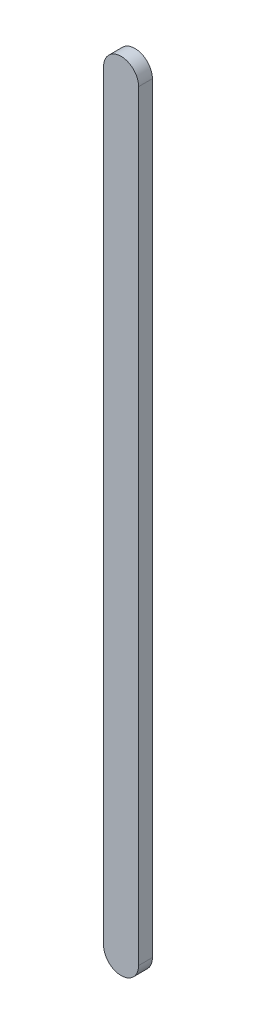
ISO-10303-21;
HEADER;
FILE_DESCRIPTION(('STEP AP214'),'2;1');
FILE_NAME('part.step','',(''),(''),'','','');
FILE_SCHEMA(('AUTOMOTIVE_DESIGN { 1 0 10303 214 1 1 1 1 }'));
ENDSEC;
DATA;
#1=APPLICATION_CONTEXT('core data for automotive mechanical design processes');
#2=APPLICATION_PROTOCOL_DEFINITION('international standard','automotive_design',2000,#1);
#3=PRODUCT_CONTEXT('',#1,'mechanical');
#4=PRODUCT('Part','Part','',(#3));
#5=PRODUCT_RELATED_PRODUCT_CATEGORY('part','',(#4));
#6=PRODUCT_DEFINITION_FORMATION('','',#4);
#7=PRODUCT_DEFINITION_CONTEXT('part definition',#1,'design');
#8=PRODUCT_DEFINITION('design','',#6,#7);
#9=PRODUCT_DEFINITION_SHAPE('','',#8);
#10=(LENGTH_UNIT() NAMED_UNIT(*) SI_UNIT(.MILLI.,.METRE.));
#11=(NAMED_UNIT(*) PLANE_ANGLE_UNIT() SI_UNIT($,.RADIAN.));
#12=(NAMED_UNIT(*) SI_UNIT($,.STERADIAN.) SOLID_ANGLE_UNIT());
#13=UNCERTAINTY_MEASURE_WITH_UNIT(LENGTH_MEASURE(1.E-05),#10,'distance_accuracy_value','');
#14=(GEOMETRIC_REPRESENTATION_CONTEXT(3) GLOBAL_UNCERTAINTY_ASSIGNED_CONTEXT((#13)) GLOBAL_UNIT_ASSIGNED_CONTEXT((#10,
#11,#12)) REPRESENTATION_CONTEXT('',''));
#15=CARTESIAN_POINT('',(0.,0.,0.));
#16=DIRECTION('',(0.,0.,1.));
#17=DIRECTION('',(1.,0.,0.));
#18=AXIS2_PLACEMENT_3D('',#15,#16,#17);
#19=CARTESIAN_POINT('',(95.885,105.4070028,0.));
#20=DIRECTION('',(-1.,0.,0.));
#21=DIRECTION('',(0.,1.,0.));
#22=AXIS2_PLACEMENT_3D('',#19,#20,#21);
#23=PLANE('',#22);
#24=DIRECTION('',(0.,1.,0.));
#25=VECTOR('',#24,1.);
#26=CARTESIAN_POINT('',(95.885,105.4070028,0.1999996));
#27=LINE('',#26,#25);
#28=CARTESIAN_POINT('',(95.885,105.4070028,0.1999996));
#29=VERTEX_POINT('',#28);
#30=CARTESIAN_POINT('',(95.885,116.459,0.1999996));
#31=VERTEX_POINT('',#30);
#32=EDGE_CURVE('E11',#29,#31,#27,.T.);
#33=ORIENTED_EDGE('',*,*,#32,.F.);
#34=DIRECTION('',(0.,0.,1.));
#35=VECTOR('',#34,1.);
#36=CARTESIAN_POINT('',(95.885,105.4070028,0.));
#37=LINE('',#36,#35);
#38=CARTESIAN_POINT('',(95.885,105.4070028,0.));
#39=VERTEX_POINT('',#38);
#40=EDGE_CURVE('E24',#39,#29,#37,.T.);
#41=ORIENTED_EDGE('',*,*,#40,.F.);
#42=DIRECTION('',(0.,1.,0.));
#43=VECTOR('',#42,1.);
#44=CARTESIAN_POINT('',(95.885,105.4070028,0.));
#45=LINE('',#44,#43);
#46=CARTESIAN_POINT('',(95.885,116.459,0.));
#47=VERTEX_POINT('',#46);
#48=EDGE_CURVE('E75',#39,#47,#45,.T.);
#49=ORIENTED_EDGE('',*,*,#48,.T.);
#50=DIRECTION('',(0.,0.,1.));
#51=VECTOR('',#50,1.);
#52=CARTESIAN_POINT('',(95.885,116.459,0.));
#53=LINE('',#52,#51);
#54=EDGE_CURVE('E37',#47,#31,#53,.T.);
#55=ORIENTED_EDGE('',*,*,#54,.T.);
#56=EDGE_LOOP('',(#33,#41,#49,#55));
#57=FACE_BOUND('',#56,.T.);
#58=ADVANCED_FACE('F17',(#57),#23,.F.);
#59=CARTESIAN_POINT('',(95.631,116.459,0.));
#60=DIRECTION('',(0.,0.,-1.));
#61=DIRECTION('',(1.,1.11896493820486E-13,0.));
#62=AXIS2_PLACEMENT_3D('',#59,#60,#61);
#63=CYLINDRICAL_SURFACE('',#62,0.25400000000001);
#64=CARTESIAN_POINT('',(95.631,116.459,0.1999996));
#65=DIRECTION('',(0.,0.,1.));
#66=DIRECTION('',(1.,1.11896493820486E-13,0.));
#67=AXIS2_PLACEMENT_3D('',#64,#65,#66);
#68=CIRCLE('',#67,0.25400000000001);
#69=CARTESIAN_POINT('',(95.377,116.459,0.1999996));
#70=VERTEX_POINT('',#69);
#71=EDGE_CURVE('E83',#31,#70,#68,.T.);
#72=ORIENTED_EDGE('',*,*,#71,.F.);
#73=ORIENTED_EDGE('',*,*,#54,.F.);
#74=CARTESIAN_POINT('',(95.631,116.459,0.));
#75=DIRECTION('',(0.,0.,1.));
#76=DIRECTION('',(1.,1.11896493820486E-13,0.));
#77=AXIS2_PLACEMENT_3D('',#74,#75,#76);
#78=CIRCLE('',#77,0.25400000000001);
#79=CARTESIAN_POINT('',(95.377,116.459,0.));
#80=VERTEX_POINT('',#79);
#81=EDGE_CURVE('E81',#47,#80,#78,.T.);
#82=ORIENTED_EDGE('',*,*,#81,.T.);
#83=DIRECTION('',(0.,0.,1.));
#84=VECTOR('',#83,1.);
#85=CARTESIAN_POINT('',(95.377,116.459,0.));
#86=LINE('',#85,#84);
#87=EDGE_CURVE('E67',#80,#70,#86,.T.);
#88=ORIENTED_EDGE('',*,*,#87,.T.);
#89=EDGE_LOOP('',(#72,#73,#82,#88));
#90=FACE_BOUND('',#89,.T.);
#91=ADVANCED_FACE('F89',(#90),#63,.T.);
#92=CARTESIAN_POINT('',(95.377,116.459,0.));
#93=DIRECTION('',(1.,0.,0.));
#94=DIRECTION('',(0.,-1.,0.));
#95=AXIS2_PLACEMENT_3D('',#92,#93,#94);
#96=PLANE('',#95);
#97=DIRECTION('',(0.,-1.,0.));
#98=VECTOR('',#97,1.);
#99=CARTESIAN_POINT('',(95.377,116.459,0.1999996));
#100=LINE('',#99,#98);
#101=CARTESIAN_POINT('',(95.377,105.4070028,0.1999996));
#102=VERTEX_POINT('',#101);
#103=EDGE_CURVE('E71',#70,#102,#100,.T.);
#104=ORIENTED_EDGE('',*,*,#103,.F.);
#105=ORIENTED_EDGE('',*,*,#87,.F.);
#106=DIRECTION('',(0.,-1.,0.));
#107=VECTOR('',#106,1.);
#108=CARTESIAN_POINT('',(95.377,116.459,0.));
#109=LINE('',#108,#107);
#110=CARTESIAN_POINT('',(95.377,105.4070028,0.));
#111=VERTEX_POINT('',#110);
#112=EDGE_CURVE('E63',#80,#111,#109,.T.);
#113=ORIENTED_EDGE('',*,*,#112,.T.);
#114=DIRECTION('',(0.,0.,1.));
#115=VECTOR('',#114,1.);
#116=CARTESIAN_POINT('',(95.377,105.4070028,0.));
#117=LINE('',#116,#115);
#118=EDGE_CURVE('E53',#111,#102,#117,.T.);
#119=ORIENTED_EDGE('',*,*,#118,.T.);
#120=EDGE_LOOP('',(#104,#105,#113,#119));
#121=FACE_BOUND('',#120,.T.);
#122=ADVANCED_FACE('F66',(#121),#96,.F.);
#123=CARTESIAN_POINT('',(95.631,105.4070028,0.));
#124=DIRECTION('',(0.,0.,-1.));
#125=DIRECTION('',(-1.,-1.11896493820486E-13,0.));
#126=AXIS2_PLACEMENT_3D('',#123,#124,#125);
#127=CYLINDRICAL_SURFACE('',#126,0.25400000000001);
#128=CARTESIAN_POINT('',(95.631,105.4070028,0.1999996));
#129=DIRECTION('',(0.,0.,1.));
#130=DIRECTION('',(-1.,-1.11896493820486E-13,0.));
#131=AXIS2_PLACEMENT_3D('',#128,#129,#130);
#132=CIRCLE('',#131,0.25400000000001);
#133=EDGE_CURVE('E59',#102,#29,#132,.T.);
#134=ORIENTED_EDGE('',*,*,#133,.F.);
#135=ORIENTED_EDGE('',*,*,#118,.F.);
#136=CARTESIAN_POINT('',(95.631,105.4070028,0.));
#137=DIRECTION('',(0.,0.,1.));
#138=DIRECTION('',(-1.,-1.11896493820486E-13,0.));
#139=AXIS2_PLACEMENT_3D('',#136,#137,#138);
#140=CIRCLE('',#139,0.25400000000001);
#141=EDGE_CURVE('E57',#111,#39,#140,.T.);
#142=ORIENTED_EDGE('',*,*,#141,.T.);
#143=ORIENTED_EDGE('',*,*,#40,.T.);
#144=EDGE_LOOP('',(#134,#135,#142,#143));
#145=FACE_BOUND('',#144,.T.);
#146=ADVANCED_FACE('F55',(#145),#127,.T.);
#147=CARTESIAN_POINT('',(95.885,105.4070028,0.));
#148=DIRECTION('',(0.,0.,-1.));
#149=DIRECTION('',(-1.,0.,0.));
#150=AXIS2_PLACEMENT_3D('',#147,#148,#149);
#151=PLANE('',#150);
#152=ORIENTED_EDGE('',*,*,#141,.F.);
#153=ORIENTED_EDGE('',*,*,#112,.F.);
#154=ORIENTED_EDGE('',*,*,#81,.F.);
#155=ORIENTED_EDGE('',*,*,#48,.F.);
#156=EDGE_LOOP('',(#152,#153,#154,#155));
#157=FACE_BOUND('',#156,.T.);
#158=ADVANCED_FACE('F74',(#157),#151,.T.);
#159=CARTESIAN_POINT('',(95.885,105.4070028,0.1999996));
#160=DIRECTION('',(0.,0.,-1.));
#161=DIRECTION('',(-1.,0.,0.));
#162=AXIS2_PLACEMENT_3D('',#159,#160,#161);
#163=PLANE('',#162);
#164=ORIENTED_EDGE('',*,*,#32,.T.);
#165=ORIENTED_EDGE('',*,*,#71,.T.);
#166=ORIENTED_EDGE('',*,*,#103,.T.);
#167=ORIENTED_EDGE('',*,*,#133,.T.);
#168=EDGE_LOOP('',(#164,#165,#166,#167));
#169=FACE_BOUND('',#168,.T.);
#170=ADVANCED_FACE('F91',(#169),#163,.F.);
#171=CLOSED_SHELL('',(#58,#91,#122,#146,#158,#170));
#172=MANIFOLD_SOLID_BREP('B1',#171);
#173=ADVANCED_BREP_SHAPE_REPRESENTATION('',(#18,#172),#14);
#174=SHAPE_DEFINITION_REPRESENTATION(#9,#173);
ENDSEC;
END-ISO-10303-21;
